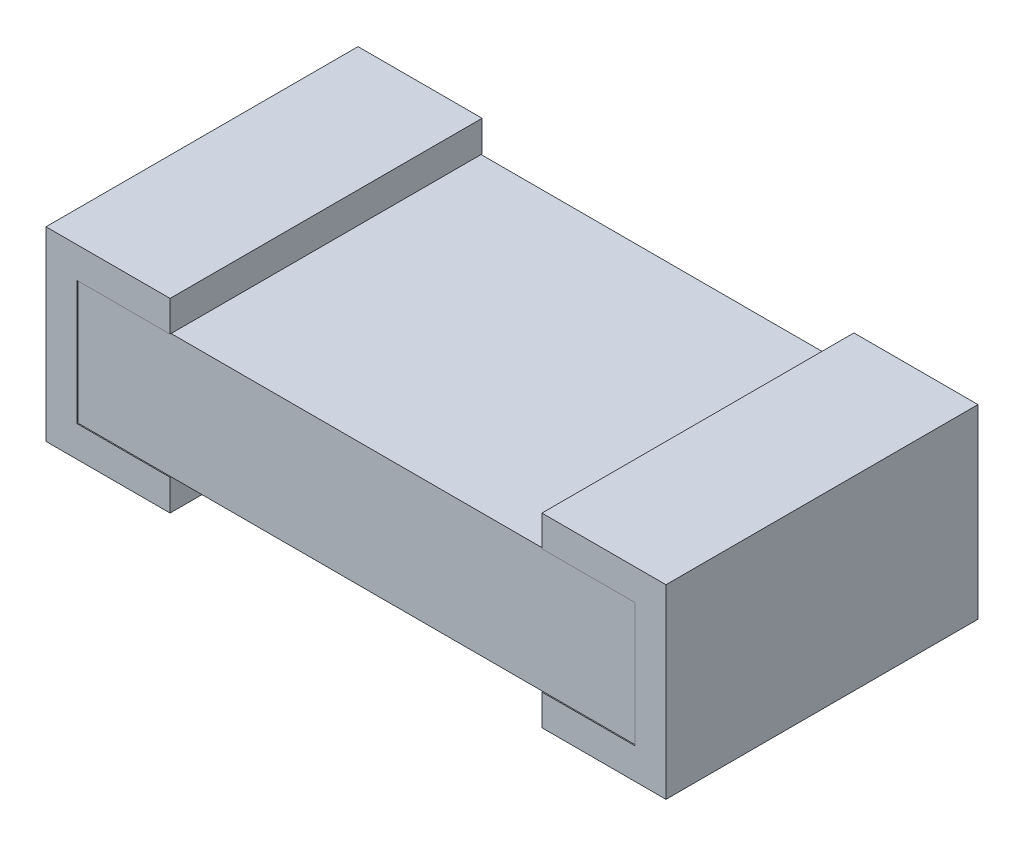
ISO-10303-21;
HEADER;
FILE_DESCRIPTION(('STEP AP214'),'2;1');
FILE_NAME('part.step','',(''),(''),'','','');
FILE_SCHEMA(('AUTOMOTIVE_DESIGN { 1 0 10303 214 1 1 1 1 }'));
ENDSEC;
DATA;
#1=APPLICATION_CONTEXT('core data for automotive mechanical design processes');
#2=APPLICATION_PROTOCOL_DEFINITION('international standard','automotive_design',2000,#1);
#3=PRODUCT_CONTEXT('',#1,'mechanical');
#4=PRODUCT('Part','Part','',(#3));
#5=PRODUCT_RELATED_PRODUCT_CATEGORY('part','',(#4));
#6=PRODUCT_DEFINITION_FORMATION('','',#4);
#7=PRODUCT_DEFINITION_CONTEXT('part definition',#1,'design');
#8=PRODUCT_DEFINITION('design','',#6,#7);
#9=PRODUCT_DEFINITION_SHAPE('','',#8);
#10=(LENGTH_UNIT() NAMED_UNIT(*) SI_UNIT(.MILLI.,.METRE.));
#11=(NAMED_UNIT(*) PLANE_ANGLE_UNIT() SI_UNIT($,.RADIAN.));
#12=(NAMED_UNIT(*) SI_UNIT($,.STERADIAN.) SOLID_ANGLE_UNIT());
#13=UNCERTAINTY_MEASURE_WITH_UNIT(LENGTH_MEASURE(1.E-05),#10,'distance_accuracy_value','');
#14=(GEOMETRIC_REPRESENTATION_CONTEXT(3) GLOBAL_UNCERTAINTY_ASSIGNED_CONTEXT((#13)) GLOBAL_UNIT_ASSIGNED_CONTEXT((#10,
#11,#12)) REPRESENTATION_CONTEXT('',''));
#15=CARTESIAN_POINT('',(0.,0.,0.));
#16=DIRECTION('',(0.,0.,1.));
#17=DIRECTION('',(1.,0.,0.));
#18=AXIS2_PLACEMENT_3D('',#15,#16,#17);
#19=CARTESIAN_POINT('',(-0.686,0.1525,0.381));
#20=DIRECTION('',(0.,-1.,0.));
#21=DIRECTION('',(0.,0.,-1.));
#22=AXIS2_PLACEMENT_3D('',#19,#20,#21);
#23=PLANE('',#22);
#24=DIRECTION('',(-1.,0.,0.));
#25=VECTOR('',#24,1.);
#26=CARTESIAN_POINT('',(-0.686,0.1525,0.381));
#27=LINE('',#26,#25);
#28=CARTESIAN_POINT('',(0.457,0.1525,0.381));
#29=VERTEX_POINT('',#28);
#30=CARTESIAN_POINT('',(-0.457,0.1525,0.381));
#31=VERTEX_POINT('',#30);
#32=EDGE_CURVE('E59',#29,#31,#27,.T.);
#33=ORIENTED_EDGE('',*,*,#32,.F.);
#34=DIRECTION('',(0.,0.,-1.));
#35=VECTOR('',#34,1.);
#36=CARTESIAN_POINT('',(0.457,0.1525,0.3835));
#37=LINE('',#36,#35);
#38=CARTESIAN_POINT('',(0.457,0.1525,-0.381));
#39=VERTEX_POINT('',#38);
#40=EDGE_CURVE('E206',#29,#39,#37,.T.);
#41=ORIENTED_EDGE('',*,*,#40,.T.);
#42=DIRECTION('',(-1.,0.,0.));
#43=VECTOR('',#42,1.);
#44=CARTESIAN_POINT('',(-0.686,0.1525,-0.381));
#45=LINE('',#44,#43);
#46=CARTESIAN_POINT('',(-0.457,0.1525,-0.381));
#47=VERTEX_POINT('',#46);
#48=EDGE_CURVE('E370',#39,#47,#45,.T.);
#49=ORIENTED_EDGE('',*,*,#48,.T.);
#50=DIRECTION('',(0.,0.,-1.));
#51=VECTOR('',#50,1.);
#52=CARTESIAN_POINT('',(-0.457,0.1525,0.3835));
#53=LINE('',#52,#51);
#54=EDGE_CURVE('E329',#31,#47,#53,.T.);
#55=ORIENTED_EDGE('',*,*,#54,.F.);
#56=EDGE_LOOP('',(#33,#41,#49,#55));
#57=FACE_BOUND('',#56,.T.);
#58=ADVANCED_FACE('F35',(#57),#23,.F.);
#59=CARTESIAN_POINT('',(-0.686,-0.1525,0.381));
#60=DIRECTION('',(0.,1.,0.));
#61=DIRECTION('',(0.,0.,1.));
#62=AXIS2_PLACEMENT_3D('',#59,#60,#61);
#63=PLANE('',#62);
#64=DIRECTION('',(1.,0.,0.));
#65=VECTOR('',#64,1.);
#66=CARTESIAN_POINT('',(-0.686,-0.1525,-0.381));
#67=LINE('',#66,#65);
#68=CARTESIAN_POINT('',(-0.457,-0.1525,-0.381));
#69=VERTEX_POINT('',#68);
#70=CARTESIAN_POINT('',(0.457,-0.1525,-0.381));
#71=VERTEX_POINT('',#70);
#72=EDGE_CURVE('E377',#69,#71,#67,.T.);
#73=ORIENTED_EDGE('',*,*,#72,.T.);
#74=DIRECTION('',(0.,0.,-1.));
#75=VECTOR('',#74,1.);
#76=CARTESIAN_POINT('',(0.457,-0.1525,0.3835));
#77=LINE('',#76,#75);
#78=CARTESIAN_POINT('',(0.457,-0.1525,0.381));
#79=VERTEX_POINT('',#78);
#80=EDGE_CURVE('E51',#79,#71,#77,.T.);
#81=ORIENTED_EDGE('',*,*,#80,.F.);
#82=DIRECTION('',(1.,0.,0.));
#83=VECTOR('',#82,1.);
#84=CARTESIAN_POINT('',(-0.686,-0.1525,0.381));
#85=LINE('',#84,#83);
#86=CARTESIAN_POINT('',(-0.457,-0.1525,0.381));
#87=VERTEX_POINT('',#86);
#88=EDGE_CURVE('E43',#87,#79,#85,.T.);
#89=ORIENTED_EDGE('',*,*,#88,.F.);
#90=DIRECTION('',(0.,0.,-1.));
#91=VECTOR('',#90,1.);
#92=CARTESIAN_POINT('',(-0.457,-0.1525,0.3835));
#93=LINE('',#92,#91);
#94=EDGE_CURVE('E342',#87,#69,#93,.T.);
#95=ORIENTED_EDGE('',*,*,#94,.T.);
#96=EDGE_LOOP('',(#73,#81,#89,#95));
#97=FACE_BOUND('',#96,.T.);
#98=ADVANCED_FACE('F393',(#97),#63,.F.);
#99=CARTESIAN_POINT('',(0.686,0.1525,0.381));
#100=DIRECTION('',(0.,0.,-1.));
#101=DIRECTION('',(-1.,0.,0.));
#102=AXIS2_PLACEMENT_3D('',#99,#100,#101);
#103=PLANE('',#102);
#104=DIRECTION('',(0.,1.,0.));
#105=VECTOR('',#104,1.);
#106=CARTESIAN_POINT('',(0.686,-0.1525,0.381));
#107=LINE('',#106,#105);
#108=CARTESIAN_POINT('',(0.686,-0.1525,0.381));
#109=VERTEX_POINT('',#108);
#110=CARTESIAN_POINT('',(0.686,0.1525,0.381));
#111=VERTEX_POINT('',#110);
#112=EDGE_CURVE('E358',#109,#111,#107,.T.);
#113=ORIENTED_EDGE('',*,*,#112,.T.);
#114=EDGE_CURVE('E360',#111,#29,#27,.T.);
#115=ORIENTED_EDGE('',*,*,#114,.T.);
#116=ORIENTED_EDGE('',*,*,#32,.T.);
#117=DIRECTION('',(1.,0.,0.));
#118=VECTOR('',#117,1.);
#119=CARTESIAN_POINT('',(0.686,0.1525,0.381));
#120=LINE('',#119,#118);
#121=CARTESIAN_POINT('',(-0.686,0.1525,0.381));
#122=VERTEX_POINT('',#121);
#123=EDGE_CURVE('E354',#122,#31,#120,.T.);
#124=ORIENTED_EDGE('',*,*,#123,.F.);
#125=DIRECTION('',(0.,-1.,0.));
#126=VECTOR('',#125,1.);
#127=CARTESIAN_POINT('',(-0.686,-0.1525,0.381));
#128=LINE('',#127,#126);
#129=CARTESIAN_POINT('',(-0.686,-0.1525,0.381));
#130=VERTEX_POINT('',#129);
#131=EDGE_CURVE('E362',#122,#130,#128,.T.);
#132=ORIENTED_EDGE('',*,*,#131,.T.);
#133=EDGE_CURVE('E11',#130,#87,#85,.T.);
#134=ORIENTED_EDGE('',*,*,#133,.T.);
#135=ORIENTED_EDGE('',*,*,#88,.T.);
#136=DIRECTION('',(1.,0.,0.));
#137=VECTOR('',#136,1.);
#138=CARTESIAN_POINT('',(0.686,-0.1525,0.381));
#139=LINE('',#138,#137);
#140=EDGE_CURVE('E210',#79,#109,#139,.T.);
#141=ORIENTED_EDGE('',*,*,#140,.T.);
#142=EDGE_LOOP('',(#113,#115,#116,#124,#132,#134,#135,#141));
#143=FACE_BOUND('',#142,.T.);
#144=ADVANCED_FACE('F420',(#143),#103,.F.);
#145=CARTESIAN_POINT('',(0.686,0.1525,-0.381));
#146=DIRECTION('',(0.,0.,-1.));
#147=DIRECTION('',(-1.,0.,0.));
#148=AXIS2_PLACEMENT_3D('',#145,#146,#147);
#149=PLANE('',#148);
#150=DIRECTION('',(0.,1.,0.));
#151=VECTOR('',#150,1.);
#152=CARTESIAN_POINT('',(0.686,-0.1525,-0.381));
#153=LINE('',#152,#151);
#154=CARTESIAN_POINT('',(0.686,-0.1525,-0.381));
#155=VERTEX_POINT('',#154);
#156=CARTESIAN_POINT('',(0.686,0.1525,-0.381));
#157=VERTEX_POINT('',#156);
#158=EDGE_CURVE('E357',#155,#157,#153,.T.);
#159=ORIENTED_EDGE('',*,*,#158,.F.);
#160=EDGE_CURVE('E372',#71,#155,#67,.T.);
#161=ORIENTED_EDGE('',*,*,#160,.F.);
#162=ORIENTED_EDGE('',*,*,#72,.F.);
#163=CARTESIAN_POINT('',(-0.686,-0.1525,-0.381));
#164=VERTEX_POINT('',#163);
#165=EDGE_CURVE('E38',#164,#69,#67,.T.);
#166=ORIENTED_EDGE('',*,*,#165,.F.);
#167=DIRECTION('',(0.,-1.,0.));
#168=VECTOR('',#167,1.);
#169=CARTESIAN_POINT('',(-0.686,-0.1525,-0.381));
#170=LINE('',#169,#168);
#171=CARTESIAN_POINT('',(-0.686,0.1525,-0.381));
#172=VERTEX_POINT('',#171);
#173=EDGE_CURVE('E369',#172,#164,#170,.T.);
#174=ORIENTED_EDGE('',*,*,#173,.F.);
#175=EDGE_CURVE('E366',#47,#172,#45,.T.);
#176=ORIENTED_EDGE('',*,*,#175,.F.);
#177=ORIENTED_EDGE('',*,*,#48,.F.);
#178=EDGE_CURVE('E367',#157,#39,#45,.T.);
#179=ORIENTED_EDGE('',*,*,#178,.F.);
#180=EDGE_LOOP('',(#159,#161,#162,#166,#174,#176,#177,#179));
#181=FACE_BOUND('',#180,.T.);
#182=ADVANCED_FACE('F394',(#181),#149,.T.);
#183=CARTESIAN_POINT('',(-0.686,-0.1525,0.3835));
#184=DIRECTION('',(0.,-1.,0.));
#185=DIRECTION('',(0.,0.,-1.));
#186=AXIS2_PLACEMENT_3D('',#183,#184,#185);
#187=PLANE('',#186);
#188=CARTESIAN_POINT('',(-0.457,-0.1525,0.3835));
#189=VERTEX_POINT('',#188);
#190=EDGE_CURVE('E338',#189,#87,#93,.T.);
#191=ORIENTED_EDGE('',*,*,#190,.T.);
#192=ORIENTED_EDGE('',*,*,#133,.F.);
#193=DIRECTION('',(0.,0.,-1.));
#194=VECTOR('',#193,1.);
#195=CARTESIAN_POINT('',(-0.686,-0.1525,0.3835));
#196=LINE('',#195,#194);
#197=CARTESIAN_POINT('',(-0.686,-0.1525,0.3835));
#198=VERTEX_POINT('',#197);
#199=EDGE_CURVE('E334',#198,#130,#196,.T.);
#200=ORIENTED_EDGE('',*,*,#199,.F.);
#201=DIRECTION('',(-1.,0.,0.));
#202=VECTOR('',#201,1.);
#203=CARTESIAN_POINT('',(-0.686,-0.1525,0.3835));
#204=LINE('',#203,#202);
#205=EDGE_CURVE('E299',#189,#198,#204,.T.);
#206=ORIENTED_EDGE('',*,*,#205,.F.);
#207=EDGE_LOOP('',(#191,#192,#200,#206));
#208=FACE_BOUND('',#207,.T.);
#209=ADVANCED_FACE('F425',(#208),#187,.F.);
#210=CARTESIAN_POINT('',(-0.686,0.1525,0.3835));
#211=DIRECTION('',(-1.,0.,0.));
#212=DIRECTION('',(0.,0.,1.));
#213=AXIS2_PLACEMENT_3D('',#210,#211,#212);
#214=PLANE('',#213);
#215=ORIENTED_EDGE('',*,*,#199,.T.);
#216=ORIENTED_EDGE('',*,*,#131,.F.);
#217=DIRECTION('',(0.,0.,-1.));
#218=VECTOR('',#217,1.);
#219=CARTESIAN_POINT('',(-0.686,0.1525,0.3835));
#220=LINE('',#219,#218);
#221=CARTESIAN_POINT('',(-0.686,0.1525,0.3835));
#222=VERTEX_POINT('',#221);
#223=EDGE_CURVE('E330',#222,#122,#220,.T.);
#224=ORIENTED_EDGE('',*,*,#223,.F.);
#225=DIRECTION('',(0.,1.,0.));
#226=VECTOR('',#225,1.);
#227=CARTESIAN_POINT('',(-0.686,0.1525,0.3835));
#228=LINE('',#227,#226);
#229=EDGE_CURVE('E301',#198,#222,#228,.T.);
#230=ORIENTED_EDGE('',*,*,#229,.F.);
#231=EDGE_LOOP('',(#215,#216,#224,#230));
#232=FACE_BOUND('',#231,.T.);
#233=ADVANCED_FACE('F429',(#232),#214,.F.);
#234=CARTESIAN_POINT('',(-0.457,0.1525,0.3835));
#235=DIRECTION('',(0.,1.,0.));
#236=DIRECTION('',(0.,0.,1.));
#237=AXIS2_PLACEMENT_3D('',#234,#235,#236);
#238=PLANE('',#237);
#239=ORIENTED_EDGE('',*,*,#223,.T.);
#240=ORIENTED_EDGE('',*,*,#123,.T.);
#241=CARTESIAN_POINT('',(-0.457,0.1525,0.3835));
#242=VERTEX_POINT('',#241);
#243=EDGE_CURVE('E325',#242,#31,#53,.T.);
#244=ORIENTED_EDGE('',*,*,#243,.F.);
#245=DIRECTION('',(1.,0.,0.));
#246=VECTOR('',#245,1.);
#247=CARTESIAN_POINT('',(-0.457,0.1525,0.3835));
#248=LINE('',#247,#246);
#249=EDGE_CURVE('E303',#222,#242,#248,.T.);
#250=ORIENTED_EDGE('',*,*,#249,.F.);
#251=EDGE_LOOP('',(#239,#240,#244,#250));
#252=FACE_BOUND('',#251,.T.);
#253=ADVANCED_FACE('F455',(#252),#238,.F.);
#254=CARTESIAN_POINT('',(-0.457,0.2285,0.3835));
#255=DIRECTION('',(-1.,0.,0.));
#256=DIRECTION('',(0.,-1.,0.));
#257=AXIS2_PLACEMENT_3D('',#254,#255,#256);
#258=PLANE('',#257);
#259=DIRECTION('',(0.,1.,0.));
#260=VECTOR('',#259,1.);
#261=CARTESIAN_POINT('',(-0.457,0.2285,-0.3835));
#262=LINE('',#261,#260);
#263=CARTESIAN_POINT('',(-0.457,0.1525,-0.3835));
#264=VERTEX_POINT('',#263);
#265=CARTESIAN_POINT('',(-0.457,0.2285,-0.3835));
#266=VERTEX_POINT('',#265);
#267=EDGE_CURVE('E286',#264,#266,#262,.T.);
#268=ORIENTED_EDGE('',*,*,#267,.T.);
#269=DIRECTION('',(0.,0.,-1.));
#270=VECTOR('',#269,1.);
#271=CARTESIAN_POINT('',(-0.457,0.2285,0.3835));
#272=LINE('',#271,#270);
#273=CARTESIAN_POINT('',(-0.457,0.2285,0.3835));
#274=VERTEX_POINT('',#273);
#275=EDGE_CURVE('E351',#274,#266,#272,.T.);
#276=ORIENTED_EDGE('',*,*,#275,.F.);
#277=DIRECTION('',(0.,1.,0.));
#278=VECTOR('',#277,1.);
#279=CARTESIAN_POINT('',(-0.457,0.2285,0.3835));
#280=LINE('',#279,#278);
#281=EDGE_CURVE('E287',#242,#274,#280,.T.);
#282=ORIENTED_EDGE('',*,*,#281,.F.);
#283=ORIENTED_EDGE('',*,*,#243,.T.);
#284=ORIENTED_EDGE('',*,*,#54,.T.);
#285=EDGE_CURVE('E305',#47,#264,#53,.T.);
#286=ORIENTED_EDGE('',*,*,#285,.T.);
#287=EDGE_LOOP('',(#268,#276,#282,#283,#284,#286));
#288=FACE_BOUND('',#287,.T.);
#289=ADVANCED_FACE('F457',(#288),#258,.F.);
#290=CARTESIAN_POINT('',(-0.762,0.2285,0.3835));
#291=DIRECTION('',(0.,-1.,0.));
#292=DIRECTION('',(0.,0.,-1.));
#293=AXIS2_PLACEMENT_3D('',#290,#291,#292);
#294=PLANE('',#293);
#295=DIRECTION('',(-1.,0.,0.));
#296=VECTOR('',#295,1.);
#297=CARTESIAN_POINT('',(-0.762,0.2285,-0.3835));
#298=LINE('',#297,#296);
#299=CARTESIAN_POINT('',(-0.762,0.2285,-0.3835));
#300=VERTEX_POINT('',#299);
#301=EDGE_CURVE('E308',#266,#300,#298,.T.);
#302=ORIENTED_EDGE('',*,*,#301,.T.);
#303=DIRECTION('',(0.,0.,-1.));
#304=VECTOR('',#303,1.);
#305=CARTESIAN_POINT('',(-0.762,0.2285,0.3835));
#306=LINE('',#305,#304);
#307=CARTESIAN_POINT('',(-0.762,0.2285,0.3835));
#308=VERTEX_POINT('',#307);
#309=EDGE_CURVE('E348',#308,#300,#306,.T.);
#310=ORIENTED_EDGE('',*,*,#309,.F.);
#311=DIRECTION('',(-1.,0.,0.));
#312=VECTOR('',#311,1.);
#313=CARTESIAN_POINT('',(-0.762,0.2285,0.3835));
#314=LINE('',#313,#312);
#315=EDGE_CURVE('E290',#274,#308,#314,.T.);
#316=ORIENTED_EDGE('',*,*,#315,.F.);
#317=ORIENTED_EDGE('',*,*,#275,.T.);
#318=EDGE_LOOP('',(#302,#310,#316,#317));
#319=FACE_BOUND('',#318,.T.);
#320=ADVANCED_FACE('F463',(#319),#294,.F.);
#321=CARTESIAN_POINT('',(-0.762,-0.2285,0.3835));
#322=DIRECTION('',(1.,0.,0.));
#323=DIRECTION('',(0.,0.,-1.));
#324=AXIS2_PLACEMENT_3D('',#321,#322,#323);
#325=PLANE('',#324);
#326=DIRECTION('',(0.,-1.,0.));
#327=VECTOR('',#326,1.);
#328=CARTESIAN_POINT('',(-0.762,-0.2285,-0.3835));
#329=LINE('',#328,#327);
#330=CARTESIAN_POINT('',(-0.762,-0.2285,-0.3835));
#331=VERTEX_POINT('',#330);
#332=EDGE_CURVE('E310',#300,#331,#329,.T.);
#333=ORIENTED_EDGE('',*,*,#332,.T.);
#334=DIRECTION('',(0.,0.,-1.));
#335=VECTOR('',#334,1.);
#336=CARTESIAN_POINT('',(-0.762,-0.2285,0.3835));
#337=LINE('',#336,#335);
#338=CARTESIAN_POINT('',(-0.762,-0.2285,0.3835));
#339=VERTEX_POINT('',#338);
#340=EDGE_CURVE('E345',#339,#331,#337,.T.);
#341=ORIENTED_EDGE('',*,*,#340,.F.);
#342=DIRECTION('',(0.,-1.,0.));
#343=VECTOR('',#342,1.);
#344=CARTESIAN_POINT('',(-0.762,-0.2285,0.3835));
#345=LINE('',#344,#343);
#346=EDGE_CURVE('E293',#308,#339,#345,.T.);
#347=ORIENTED_EDGE('',*,*,#346,.F.);
#348=ORIENTED_EDGE('',*,*,#309,.T.);
#349=EDGE_LOOP('',(#333,#341,#347,#348));
#350=FACE_BOUND('',#349,.T.);
#351=ADVANCED_FACE('F465',(#350),#325,.F.);
#352=CARTESIAN_POINT('',(-0.457,-0.2285,0.3835));
#353=DIRECTION('',(0.,1.,0.));
#354=DIRECTION('',(-1.,0.,0.));
#355=AXIS2_PLACEMENT_3D('',#352,#353,#354);
#356=PLANE('',#355);
#357=DIRECTION('',(1.,0.,0.));
#358=VECTOR('',#357,1.);
#359=CARTESIAN_POINT('',(-0.457,-0.2285,-0.3835));
#360=LINE('',#359,#358);
#361=CARTESIAN_POINT('',(-0.457,-0.2285,-0.3835));
#362=VERTEX_POINT('',#361);
#363=EDGE_CURVE('E312',#331,#362,#360,.T.);
#364=ORIENTED_EDGE('',*,*,#363,.T.);
#365=DIRECTION('',(0.,0.,-1.));
#366=VECTOR('',#365,1.);
#367=CARTESIAN_POINT('',(-0.457,-0.2285,0.3835));
#368=LINE('',#367,#366);
#369=CARTESIAN_POINT('',(-0.457,-0.2285,0.3835));
#370=VERTEX_POINT('',#369);
#371=EDGE_CURVE('E341',#370,#362,#368,.T.);
#372=ORIENTED_EDGE('',*,*,#371,.F.);
#373=DIRECTION('',(1.,0.,0.));
#374=VECTOR('',#373,1.);
#375=CARTESIAN_POINT('',(-0.457,-0.2285,0.3835));
#376=LINE('',#375,#374);
#377=EDGE_CURVE('E295',#339,#370,#376,.T.);
#378=ORIENTED_EDGE('',*,*,#377,.F.);
#379=ORIENTED_EDGE('',*,*,#340,.T.);
#380=EDGE_LOOP('',(#364,#372,#378,#379));
#381=FACE_BOUND('',#380,.T.);
#382=ADVANCED_FACE('F466',(#381),#356,.F.);
#383=CARTESIAN_POINT('',(-0.457,-0.1525,0.3835));
#384=DIRECTION('',(-1.,0.,0.));
#385=DIRECTION('',(0.,-1.,0.));
#386=AXIS2_PLACEMENT_3D('',#383,#384,#385);
#387=PLANE('',#386);
#388=DIRECTION('',(0.,1.,0.));
#389=VECTOR('',#388,1.);
#390=CARTESIAN_POINT('',(-0.457,-0.1525,-0.3835));
#391=LINE('',#390,#389);
#392=CARTESIAN_POINT('',(-0.457,-0.1525,-0.3835));
#393=VERTEX_POINT('',#392);
#394=EDGE_CURVE('E314',#362,#393,#391,.T.);
#395=ORIENTED_EDGE('',*,*,#394,.T.);
#396=EDGE_CURVE('E337',#69,#393,#93,.T.);
#397=ORIENTED_EDGE('',*,*,#396,.F.);
#398=ORIENTED_EDGE('',*,*,#94,.F.);
#399=ORIENTED_EDGE('',*,*,#190,.F.);
#400=DIRECTION('',(0.,1.,0.));
#401=VECTOR('',#400,1.);
#402=CARTESIAN_POINT('',(-0.457,-0.1525,0.3835));
#403=LINE('',#402,#401);
#404=EDGE_CURVE('E297',#370,#189,#403,.T.);
#405=ORIENTED_EDGE('',*,*,#404,.F.);
#406=ORIENTED_EDGE('',*,*,#371,.T.);
#407=EDGE_LOOP('',(#395,#397,#398,#399,#405,#406));
#408=FACE_BOUND('',#407,.T.);
#409=ADVANCED_FACE('F389',(#408),#387,.F.);
#410=ORIENTED_EDGE('',*,*,#165,.T.);
#411=ORIENTED_EDGE('',*,*,#396,.T.);
#412=DIRECTION('',(-1.,0.,0.));
#413=VECTOR('',#412,1.);
#414=CARTESIAN_POINT('',(-0.686,-0.1525,-0.3835));
#415=LINE('',#414,#413);
#416=CARTESIAN_POINT('',(-0.686,-0.1525,-0.3835));
#417=VERTEX_POINT('',#416);
#418=EDGE_CURVE('E317',#393,#417,#415,.T.);
#419=ORIENTED_EDGE('',*,*,#418,.T.);
#420=EDGE_CURVE('E333',#164,#417,#196,.T.);
#421=ORIENTED_EDGE('',*,*,#420,.F.);
#422=EDGE_LOOP('',(#410,#411,#419,#421));
#423=FACE_BOUND('',#422,.T.);
#424=ADVANCED_FACE('F384',(#423),#187,.F.);
#425=ORIENTED_EDGE('',*,*,#173,.T.);
#426=ORIENTED_EDGE('',*,*,#420,.T.);
#427=DIRECTION('',(0.,1.,0.));
#428=VECTOR('',#427,1.);
#429=CARTESIAN_POINT('',(-0.686,0.1525,-0.3835));
#430=LINE('',#429,#428);
#431=CARTESIAN_POINT('',(-0.686,0.1525,-0.3835));
#432=VERTEX_POINT('',#431);
#433=EDGE_CURVE('E320',#417,#432,#430,.T.);
#434=ORIENTED_EDGE('',*,*,#433,.T.);
#435=EDGE_CURVE('E328',#172,#432,#220,.T.);
#436=ORIENTED_EDGE('',*,*,#435,.F.);
#437=EDGE_LOOP('',(#425,#426,#434,#436));
#438=FACE_BOUND('',#437,.T.);
#439=ADVANCED_FACE('F446',(#438),#214,.F.);
#440=ORIENTED_EDGE('',*,*,#175,.T.);
#441=ORIENTED_EDGE('',*,*,#435,.T.);
#442=DIRECTION('',(1.,0.,0.));
#443=VECTOR('',#442,1.);
#444=CARTESIAN_POINT('',(-0.457,0.1525,-0.3835));
#445=LINE('',#444,#443);
#446=EDGE_CURVE('E291',#432,#264,#445,.T.);
#447=ORIENTED_EDGE('',*,*,#446,.T.);
#448=ORIENTED_EDGE('',*,*,#285,.F.);
#449=EDGE_LOOP('',(#440,#441,#447,#448));
#450=FACE_BOUND('',#449,.T.);
#451=ADVANCED_FACE('F449',(#450),#238,.F.);
#452=CARTESIAN_POINT('',(-0.457,0.1525,0.3835));
#453=DIRECTION('',(0.,0.,-1.));
#454=DIRECTION('',(-1.,0.,0.));
#455=AXIS2_PLACEMENT_3D('',#452,#453,#454);
#456=PLANE('',#455);
#457=ORIENTED_EDGE('',*,*,#281,.T.);
#458=ORIENTED_EDGE('',*,*,#315,.T.);
#459=ORIENTED_EDGE('',*,*,#346,.T.);
#460=ORIENTED_EDGE('',*,*,#377,.T.);
#461=ORIENTED_EDGE('',*,*,#404,.T.);
#462=ORIENTED_EDGE('',*,*,#205,.T.);
#463=ORIENTED_EDGE('',*,*,#229,.T.);
#464=ORIENTED_EDGE('',*,*,#249,.T.);
#465=EDGE_LOOP('',(#457,#458,#459,#460,#461,#462,#463,#464));
#466=FACE_BOUND('',#465,.T.);
#467=ADVANCED_FACE('F433',(#466),#456,.F.);
#468=CARTESIAN_POINT('',(-0.457,0.1525,-0.3835));
#469=DIRECTION('',(0.,0.,-1.));
#470=DIRECTION('',(-1.,0.,0.));
#471=AXIS2_PLACEMENT_3D('',#468,#469,#470);
#472=PLANE('',#471);
#473=ORIENTED_EDGE('',*,*,#267,.F.);
#474=ORIENTED_EDGE('',*,*,#446,.F.);
#475=ORIENTED_EDGE('',*,*,#433,.F.);
#476=ORIENTED_EDGE('',*,*,#418,.F.);
#477=ORIENTED_EDGE('',*,*,#394,.F.);
#478=ORIENTED_EDGE('',*,*,#363,.F.);
#479=ORIENTED_EDGE('',*,*,#332,.F.);
#480=ORIENTED_EDGE('',*,*,#301,.F.);
#481=EDGE_LOOP('',(#473,#474,#475,#476,#477,#478,#479,#480));
#482=FACE_BOUND('',#481,.T.);
#483=ADVANCED_FACE('F442',(#482),#472,.T.);
#484=CARTESIAN_POINT('',(0.457,0.1525,0.3835));
#485=DIRECTION('',(0.,-1.,0.));
#486=DIRECTION('',(0.,0.,-1.));
#487=AXIS2_PLACEMENT_3D('',#484,#485,#486);
#488=PLANE('',#487);
#489=ORIENTED_EDGE('',*,*,#114,.F.);
#490=DIRECTION('',(0.,0.,-1.));
#491=VECTOR('',#490,1.);
#492=CARTESIAN_POINT('',(0.686,0.1525,0.3835));
#493=LINE('',#492,#491);
#494=CARTESIAN_POINT('',(0.686,0.1525,0.3835));
#495=VERTEX_POINT('',#494);
#496=EDGE_CURVE('E226',#495,#111,#493,.T.);
#497=ORIENTED_EDGE('',*,*,#496,.F.);
#498=DIRECTION('',(-1.,0.,0.));
#499=VECTOR('',#498,1.);
#500=CARTESIAN_POINT('',(0.457,0.1525,0.3835));
#501=LINE('',#500,#499);
#502=CARTESIAN_POINT('',(0.457,0.1525,0.3835));
#503=VERTEX_POINT('',#502);
#504=EDGE_CURVE('E217',#495,#503,#501,.T.);
#505=ORIENTED_EDGE('',*,*,#504,.T.);
#506=EDGE_CURVE('E199',#503,#29,#37,.T.);
#507=ORIENTED_EDGE('',*,*,#506,.T.);
#508=EDGE_LOOP('',(#489,#497,#505,#507));
#509=FACE_BOUND('',#508,.T.);
#510=ADVANCED_FACE('F224',(#509),#488,.T.);
#511=CARTESIAN_POINT('',(0.686,0.1525,0.3835));
#512=DIRECTION('',(-1.,0.,0.));
#513=DIRECTION('',(0.,0.,1.));
#514=AXIS2_PLACEMENT_3D('',#511,#512,#513);
#515=PLANE('',#514);
#516=ORIENTED_EDGE('',*,*,#112,.F.);
#517=DIRECTION('',(0.,0.,-1.));
#518=VECTOR('',#517,1.);
#519=CARTESIAN_POINT('',(0.686,-0.1525,0.3835));
#520=LINE('',#519,#518);
#521=CARTESIAN_POINT('',(0.686,-0.1525,0.3835));
#522=VERTEX_POINT('',#521);
#523=EDGE_CURVE('E280',#522,#109,#520,.T.);
#524=ORIENTED_EDGE('',*,*,#523,.F.);
#525=DIRECTION('',(0.,1.,0.));
#526=VECTOR('',#525,1.);
#527=CARTESIAN_POINT('',(0.686,0.1525,0.3835));
#528=LINE('',#527,#526);
#529=EDGE_CURVE('E227',#522,#495,#528,.T.);
#530=ORIENTED_EDGE('',*,*,#529,.T.);
#531=ORIENTED_EDGE('',*,*,#496,.T.);
#532=EDGE_LOOP('',(#516,#524,#530,#531));
#533=FACE_BOUND('',#532,.T.);
#534=ADVANCED_FACE('F418',(#533),#515,.T.);
#535=CARTESIAN_POINT('',(0.686,-0.1525,0.3835));
#536=DIRECTION('',(0.,1.,0.));
#537=DIRECTION('',(0.,0.,1.));
#538=AXIS2_PLACEMENT_3D('',#535,#536,#537);
#539=PLANE('',#538);
#540=ORIENTED_EDGE('',*,*,#140,.F.);
#541=CARTESIAN_POINT('',(0.457,-0.1525,0.3835));
#542=VERTEX_POINT('',#541);
#543=EDGE_CURVE('E276',#542,#79,#77,.T.);
#544=ORIENTED_EDGE('',*,*,#543,.F.);
#545=DIRECTION('',(1.,0.,0.));
#546=VECTOR('',#545,1.);
#547=CARTESIAN_POINT('',(0.686,-0.1525,0.3835));
#548=LINE('',#547,#546);
#549=EDGE_CURVE('E229',#542,#522,#548,.T.);
#550=ORIENTED_EDGE('',*,*,#549,.T.);
#551=ORIENTED_EDGE('',*,*,#523,.T.);
#552=EDGE_LOOP('',(#540,#544,#550,#551));
#553=FACE_BOUND('',#552,.T.);
#554=ADVANCED_FACE('F414',(#553),#539,.T.);
#555=CARTESIAN_POINT('',(0.457,0.2285,0.3835));
#556=DIRECTION('',(-1.,0.,0.));
#557=DIRECTION('',(0.,-1.,0.));
#558=AXIS2_PLACEMENT_3D('',#555,#556,#557);
#559=PLANE('',#558);
#560=DIRECTION('',(0.,1.,0.));
#561=VECTOR('',#560,1.);
#562=CARTESIAN_POINT('',(0.457,0.2285,-0.3835));
#563=LINE('',#562,#561);
#564=CARTESIAN_POINT('',(0.457,0.1525,-0.3835));
#565=VERTEX_POINT('',#564);
#566=CARTESIAN_POINT('',(0.457,0.2285,-0.3835));
#567=VERTEX_POINT('',#566);
#568=EDGE_CURVE('E245',#565,#567,#563,.T.);
#569=ORIENTED_EDGE('',*,*,#568,.F.);
#570=EDGE_CURVE('E212',#39,#565,#37,.T.);
#571=ORIENTED_EDGE('',*,*,#570,.F.);
#572=ORIENTED_EDGE('',*,*,#40,.F.);
#573=ORIENTED_EDGE('',*,*,#506,.F.);
#574=DIRECTION('',(0.,1.,0.));
#575=VECTOR('',#574,1.);
#576=CARTESIAN_POINT('',(0.457,0.2285,0.3835));
#577=LINE('',#576,#575);
#578=CARTESIAN_POINT('',(0.457,0.2285,0.3835));
#579=VERTEX_POINT('',#578);
#580=EDGE_CURVE('E203',#503,#579,#577,.T.);
#581=ORIENTED_EDGE('',*,*,#580,.T.);
#582=DIRECTION('',(0.,0.,-1.));
#583=VECTOR('',#582,1.);
#584=CARTESIAN_POINT('',(0.457,0.2285,0.3835));
#585=LINE('',#584,#583);
#586=EDGE_CURVE('E244',#579,#567,#585,.T.);
#587=ORIENTED_EDGE('',*,*,#586,.T.);
#588=EDGE_LOOP('',(#569,#571,#572,#573,#581,#587));
#589=FACE_BOUND('',#588,.T.);
#590=ADVANCED_FACE('F202',(#589),#559,.T.);
#591=CARTESIAN_POINT('',(0.686,0.1525,-0.3835));
#592=VERTEX_POINT('',#591);
#593=EDGE_CURVE('E283',#157,#592,#493,.T.);
#594=ORIENTED_EDGE('',*,*,#593,.F.);
#595=ORIENTED_EDGE('',*,*,#178,.T.);
#596=ORIENTED_EDGE('',*,*,#570,.T.);
#597=DIRECTION('',(-1.,0.,0.));
#598=VECTOR('',#597,1.);
#599=CARTESIAN_POINT('',(0.457,0.1525,-0.3835));
#600=LINE('',#599,#598);
#601=EDGE_CURVE('E248',#592,#565,#600,.T.);
#602=ORIENTED_EDGE('',*,*,#601,.F.);
#603=EDGE_LOOP('',(#594,#595,#596,#602));
#604=FACE_BOUND('',#603,.T.);
#605=ADVANCED_FACE('F402',(#604),#488,.T.);
#606=CARTESIAN_POINT('',(0.686,-0.1525,-0.3835));
#607=VERTEX_POINT('',#606);
#608=EDGE_CURVE('E279',#155,#607,#520,.T.);
#609=ORIENTED_EDGE('',*,*,#608,.F.);
#610=ORIENTED_EDGE('',*,*,#158,.T.);
#611=ORIENTED_EDGE('',*,*,#593,.T.);
#612=DIRECTION('',(0.,1.,0.));
#613=VECTOR('',#612,1.);
#614=CARTESIAN_POINT('',(0.686,0.1525,-0.3835));
#615=LINE('',#614,#613);
#616=EDGE_CURVE('E251',#607,#592,#615,.T.);
#617=ORIENTED_EDGE('',*,*,#616,.F.);
#618=EDGE_LOOP('',(#609,#610,#611,#617));
#619=FACE_BOUND('',#618,.T.);
#620=ADVANCED_FACE('F398',(#619),#515,.T.);
#621=CARTESIAN_POINT('',(0.457,-0.1525,-0.3835));
#622=VERTEX_POINT('',#621);
#623=EDGE_CURVE('E275',#71,#622,#77,.T.);
#624=ORIENTED_EDGE('',*,*,#623,.F.);
#625=ORIENTED_EDGE('',*,*,#160,.T.);
#626=ORIENTED_EDGE('',*,*,#608,.T.);
#627=DIRECTION('',(1.,0.,0.));
#628=VECTOR('',#627,1.);
#629=CARTESIAN_POINT('',(0.686,-0.1525,-0.3835));
#630=LINE('',#629,#628);
#631=EDGE_CURVE('E254',#622,#607,#630,.T.);
#632=ORIENTED_EDGE('',*,*,#631,.F.);
#633=EDGE_LOOP('',(#624,#625,#626,#632));
#634=FACE_BOUND('',#633,.T.);
#635=ADVANCED_FACE('F407',(#634),#539,.T.);
#636=CARTESIAN_POINT('',(0.457,-0.1525,0.3835));
#637=DIRECTION('',(-1.,0.,0.));
#638=DIRECTION('',(0.,-1.,0.));
#639=AXIS2_PLACEMENT_3D('',#636,#637,#638);
#640=PLANE('',#639);
#641=DIRECTION('',(0.,1.,0.));
#642=VECTOR('',#641,1.);
#643=CARTESIAN_POINT('',(0.457,-0.1525,-0.3835));
#644=LINE('',#643,#642);
#645=CARTESIAN_POINT('',(0.457,-0.2285,-0.3835));
#646=VERTEX_POINT('',#645);
#647=EDGE_CURVE('E257',#646,#622,#644,.T.);
#648=ORIENTED_EDGE('',*,*,#647,.F.);
#649=DIRECTION('',(0.,0.,-1.));
#650=VECTOR('',#649,1.);
#651=CARTESIAN_POINT('',(0.457,-0.2285,0.3835));
#652=LINE('',#651,#650);
#653=CARTESIAN_POINT('',(0.457,-0.2285,0.3835));
#654=VERTEX_POINT('',#653);
#655=EDGE_CURVE('E273',#654,#646,#652,.T.);
#656=ORIENTED_EDGE('',*,*,#655,.F.);
#657=DIRECTION('',(0.,1.,0.));
#658=VECTOR('',#657,1.);
#659=CARTESIAN_POINT('',(0.457,-0.1525,0.3835));
#660=LINE('',#659,#658);
#661=EDGE_CURVE('E234',#654,#542,#660,.T.);
#662=ORIENTED_EDGE('',*,*,#661,.T.);
#663=ORIENTED_EDGE('',*,*,#543,.T.);
#664=ORIENTED_EDGE('',*,*,#80,.T.);
#665=ORIENTED_EDGE('',*,*,#623,.T.);
#666=EDGE_LOOP('',(#648,#656,#662,#663,#664,#665));
#667=FACE_BOUND('',#666,.T.);
#668=ADVANCED_FACE('F409',(#667),#640,.T.);
#669=CARTESIAN_POINT('',(0.457,-0.2285,0.3835));
#670=DIRECTION('',(0.,-1.,0.));
#671=DIRECTION('',(1.,0.,0.));
#672=AXIS2_PLACEMENT_3D('',#669,#670,#671);
#673=PLANE('',#672);
#674=DIRECTION('',(-1.,0.,0.));
#675=VECTOR('',#674,1.);
#676=CARTESIAN_POINT('',(0.457,-0.2285,-0.3835));
#677=LINE('',#676,#675);
#678=CARTESIAN_POINT('',(0.762,-0.2285,-0.3835));
#679=VERTEX_POINT('',#678);
#680=EDGE_CURVE('E260',#679,#646,#677,.T.);
#681=ORIENTED_EDGE('',*,*,#680,.F.);
#682=DIRECTION('',(0.,0.,-1.));
#683=VECTOR('',#682,1.);
#684=CARTESIAN_POINT('',(0.762,-0.2285,0.3835));
#685=LINE('',#684,#683);
#686=CARTESIAN_POINT('',(0.762,-0.2285,0.3835));
#687=VERTEX_POINT('',#686);
#688=EDGE_CURVE('E271',#687,#679,#685,.T.);
#689=ORIENTED_EDGE('',*,*,#688,.F.);
#690=DIRECTION('',(-1.,0.,0.));
#691=VECTOR('',#690,1.);
#692=CARTESIAN_POINT('',(0.457,-0.2285,0.3835));
#693=LINE('',#692,#691);
#694=EDGE_CURVE('E237',#687,#654,#693,.T.);
#695=ORIENTED_EDGE('',*,*,#694,.T.);
#696=ORIENTED_EDGE('',*,*,#655,.T.);
#697=EDGE_LOOP('',(#681,#689,#695,#696));
#698=FACE_BOUND('',#697,.T.);
#699=ADVANCED_FACE('F642',(#698),#673,.T.);
#700=CARTESIAN_POINT('',(0.762,-0.2285,0.3835));
#701=DIRECTION('',(1.,0.,0.));
#702=DIRECTION('',(0.,0.,-1.));
#703=AXIS2_PLACEMENT_3D('',#700,#701,#702);
#704=PLANE('',#703);
#705=DIRECTION('',(0.,-1.,0.));
#706=VECTOR('',#705,1.);
#707=CARTESIAN_POINT('',(0.762,-0.2285,-0.3835));
#708=LINE('',#707,#706);
#709=CARTESIAN_POINT('',(0.762,0.2285,-0.3835));
#710=VERTEX_POINT('',#709);
#711=EDGE_CURVE('E263',#710,#679,#708,.T.);
#712=ORIENTED_EDGE('',*,*,#711,.F.);
#713=DIRECTION('',(0.,0.,-1.));
#714=VECTOR('',#713,1.);
#715=CARTESIAN_POINT('',(0.762,0.2285,0.3835));
#716=LINE('',#715,#714);
#717=CARTESIAN_POINT('',(0.762,0.2285,0.3835));
#718=VERTEX_POINT('',#717);
#719=EDGE_CURVE('E269',#718,#710,#716,.T.);
#720=ORIENTED_EDGE('',*,*,#719,.F.);
#721=DIRECTION('',(0.,-1.,0.));
#722=VECTOR('',#721,1.);
#723=CARTESIAN_POINT('',(0.762,-0.2285,0.3835));
#724=LINE('',#723,#722);
#725=EDGE_CURVE('E240',#718,#687,#724,.T.);
#726=ORIENTED_EDGE('',*,*,#725,.T.);
#727=ORIENTED_EDGE('',*,*,#688,.T.);
#728=EDGE_LOOP('',(#712,#720,#726,#727));
#729=FACE_BOUND('',#728,.T.);
#730=ADVANCED_FACE('F653',(#729),#704,.T.);
#731=CARTESIAN_POINT('',(0.762,0.2285,0.3835));
#732=DIRECTION('',(0.,1.,0.));
#733=DIRECTION('',(0.,0.,1.));
#734=AXIS2_PLACEMENT_3D('',#731,#732,#733);
#735=PLANE('',#734);
#736=DIRECTION('',(1.,0.,0.));
#737=VECTOR('',#736,1.);
#738=CARTESIAN_POINT('',(0.762,0.2285,-0.3835));
#739=LINE('',#738,#737);
#740=EDGE_CURVE('E222',#567,#710,#739,.T.);
#741=ORIENTED_EDGE('',*,*,#740,.F.);
#742=ORIENTED_EDGE('',*,*,#586,.F.);
#743=DIRECTION('',(1.,0.,0.));
#744=VECTOR('',#743,1.);
#745=CARTESIAN_POINT('',(0.762,0.2285,0.3835));
#746=LINE('',#745,#744);
#747=EDGE_CURVE('E221',#579,#718,#746,.T.);
#748=ORIENTED_EDGE('',*,*,#747,.T.);
#749=ORIENTED_EDGE('',*,*,#719,.T.);
#750=EDGE_LOOP('',(#741,#742,#748,#749));
#751=FACE_BOUND('',#750,.T.);
#752=ADVANCED_FACE('F664',(#751),#735,.T.);
#753=CARTESIAN_POINT('',(0.457,0.1525,0.3835));
#754=DIRECTION('',(0.,0.,-1.));
#755=DIRECTION('',(1.,0.,0.));
#756=AXIS2_PLACEMENT_3D('',#753,#754,#755);
#757=PLANE('',#756);
#758=ORIENTED_EDGE('',*,*,#580,.F.);
#759=ORIENTED_EDGE('',*,*,#504,.F.);
#760=ORIENTED_EDGE('',*,*,#529,.F.);
#761=ORIENTED_EDGE('',*,*,#549,.F.);
#762=ORIENTED_EDGE('',*,*,#661,.F.);
#763=ORIENTED_EDGE('',*,*,#694,.F.);
#764=ORIENTED_EDGE('',*,*,#725,.F.);
#765=ORIENTED_EDGE('',*,*,#747,.F.);
#766=EDGE_LOOP('',(#758,#759,#760,#761,#762,#763,#764,#765));
#767=FACE_BOUND('',#766,.T.);
#768=ADVANCED_FACE('F215',(#767),#757,.F.);
#769=CARTESIAN_POINT('',(0.457,0.1525,-0.3835));
#770=DIRECTION('',(0.,0.,-1.));
#771=DIRECTION('',(1.,0.,0.));
#772=AXIS2_PLACEMENT_3D('',#769,#770,#771);
#773=PLANE('',#772);
#774=ORIENTED_EDGE('',*,*,#568,.T.);
#775=ORIENTED_EDGE('',*,*,#740,.T.);
#776=ORIENTED_EDGE('',*,*,#711,.T.);
#777=ORIENTED_EDGE('',*,*,#680,.T.);
#778=ORIENTED_EDGE('',*,*,#647,.T.);
#779=ORIENTED_EDGE('',*,*,#631,.T.);
#780=ORIENTED_EDGE('',*,*,#616,.T.);
#781=ORIENTED_EDGE('',*,*,#601,.T.);
#782=EDGE_LOOP('',(#774,#775,#776,#777,#778,#779,#780,#781));
#783=FACE_BOUND('',#782,.T.);
#784=ADVANCED_FACE('F404',(#783),#773,.T.);
#785=CLOSED_SHELL('',(#58,#98,#144,#182,#209,#233,#253,#289,#320,#351,#382,#409,#424,#439,#451,
#467,#483,#510,#534,#554,#590,#605,#620,#635,#668,#699,#730,#752,#768,#784));
#786=MANIFOLD_SOLID_BREP('B2',#785);
#787=ADVANCED_BREP_SHAPE_REPRESENTATION('',(#18,#786),#14);
#788=SHAPE_DEFINITION_REPRESENTATION(#9,#787);
ENDSEC;
END-ISO-10303-21;
